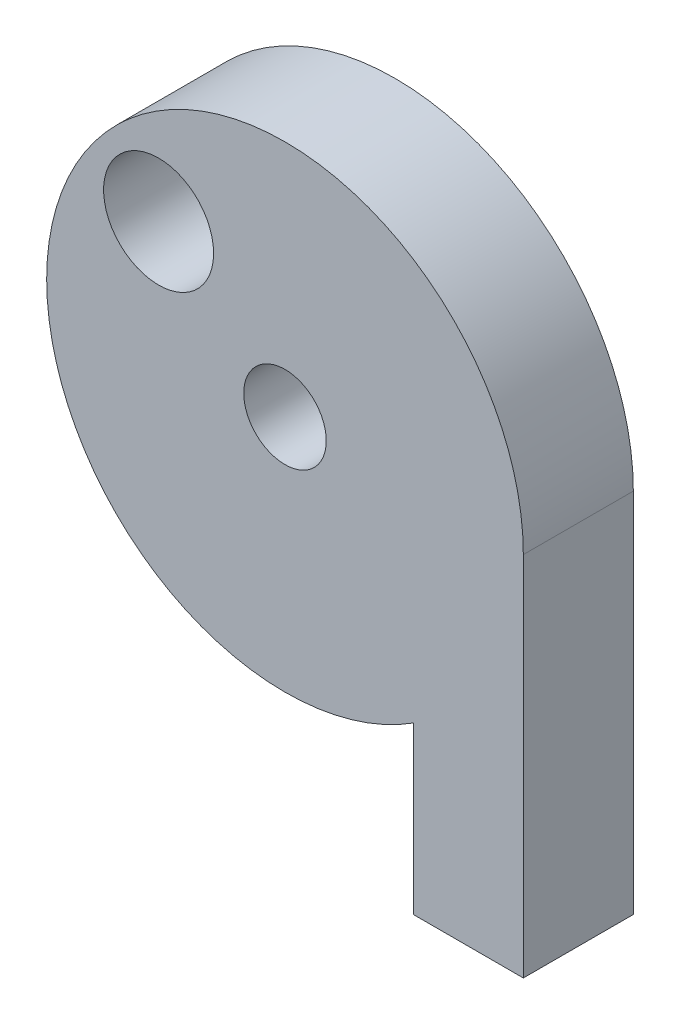
ISO-10303-21;
HEADER;
FILE_DESCRIPTION(('STEP AP214'),'2;1');
FILE_NAME('part.step','',(''),(''),'','','');
FILE_SCHEMA(('AUTOMOTIVE_DESIGN { 1 0 10303 214 1 1 1 1 }'));
ENDSEC;
DATA;
#1=APPLICATION_CONTEXT('core data for automotive mechanical design processes');
#2=APPLICATION_PROTOCOL_DEFINITION('international standard','automotive_design',2000,#1);
#3=PRODUCT_CONTEXT('',#1,'mechanical');
#4=PRODUCT('Part','Part','',(#3));
#5=PRODUCT_RELATED_PRODUCT_CATEGORY('part','',(#4));
#6=PRODUCT_DEFINITION_FORMATION('','',#4);
#7=PRODUCT_DEFINITION_CONTEXT('part definition',#1,'design');
#8=PRODUCT_DEFINITION('design','',#6,#7);
#9=PRODUCT_DEFINITION_SHAPE('','',#8);
#10=(LENGTH_UNIT() NAMED_UNIT(*) SI_UNIT(.MILLI.,.METRE.));
#11=(NAMED_UNIT(*) PLANE_ANGLE_UNIT() SI_UNIT($,.RADIAN.));
#12=(NAMED_UNIT(*) SI_UNIT($,.STERADIAN.) SOLID_ANGLE_UNIT());
#13=UNCERTAINTY_MEASURE_WITH_UNIT(LENGTH_MEASURE(1.E-05),#10,'distance_accuracy_value','');
#14=(GEOMETRIC_REPRESENTATION_CONTEXT(3) GLOBAL_UNCERTAINTY_ASSIGNED_CONTEXT((#13)) GLOBAL_UNIT_ASSIGNED_CONTEXT((#10,
#11,#12)) REPRESENTATION_CONTEXT('',''));
#15=CARTESIAN_POINT('',(0.,0.,0.));
#16=DIRECTION('',(0.,0.,1.));
#17=DIRECTION('',(1.,0.,0.));
#18=AXIS2_PLACEMENT_3D('',#15,#16,#17);
#19=CARTESIAN_POINT('',(0.,0.,3.));
#20=DIRECTION('',(0.,0.,-1.));
#21=DIRECTION('',(-1.,0.,0.));
#22=AXIS2_PLACEMENT_3D('',#19,#20,#21);
#23=CYLINDRICAL_SURFACE('',#22,13.);
#24=CARTESIAN_POINT('',(0.,0.,-3.));
#25=DIRECTION('',(0.,0.,1.));
#26=DIRECTION('',(1.,0.,0.));
#27=AXIS2_PLACEMENT_3D('',#24,#25,#26);
#28=CIRCLE('',#27,13.);
#29=CARTESIAN_POINT('',(13.,0.,-3.));
#30=VERTEX_POINT('',#29);
#31=CARTESIAN_POINT('',(7.,-10.9544511501033,-3.));
#32=VERTEX_POINT('',#31);
#33=EDGE_CURVE('E121',#30,#32,#28,.T.);
#34=ORIENTED_EDGE('',*,*,#33,.T.);
#35=DIRECTION('',(0.,0.,-1.));
#36=VECTOR('',#35,1.);
#37=CARTESIAN_POINT('',(7.,-10.9544511501033,3.));
#38=LINE('',#37,#36);
#39=CARTESIAN_POINT('',(7.,-10.9544511501033,3.));
#40=VERTEX_POINT('',#39);
#41=EDGE_CURVE('E11',#40,#32,#38,.T.);
#42=ORIENTED_EDGE('',*,*,#41,.F.);
#43=CARTESIAN_POINT('',(0.,0.,3.));
#44=DIRECTION('',(0.,0.,1.));
#45=DIRECTION('',(1.,0.,0.));
#46=AXIS2_PLACEMENT_3D('',#43,#44,#45);
#47=CIRCLE('',#46,13.);
#48=CARTESIAN_POINT('',(13.,0.,3.));
#49=VERTEX_POINT('',#48);
#50=EDGE_CURVE('E104',#49,#40,#47,.T.);
#51=ORIENTED_EDGE('',*,*,#50,.F.);
#52=DIRECTION('',(0.,0.,-1.));
#53=VECTOR('',#52,1.);
#54=CARTESIAN_POINT('',(13.,0.,3.));
#55=LINE('',#54,#53);
#56=EDGE_CURVE('E117',#49,#30,#55,.T.);
#57=ORIENTED_EDGE('',*,*,#56,.T.);
#58=EDGE_LOOP('',(#34,#42,#51,#57));
#59=FACE_BOUND('',#58,.T.);
#60=ADVANCED_FACE('F47',(#59),#23,.T.);
#61=CARTESIAN_POINT('',(7.,-20.,3.));
#62=DIRECTION('',(1.,0.,0.));
#63=DIRECTION('',(0.,1.,0.));
#64=AXIS2_PLACEMENT_3D('',#61,#62,#63);
#65=PLANE('',#64);
#66=DIRECTION('',(0.,-1.,0.));
#67=VECTOR('',#66,1.);
#68=CARTESIAN_POINT('',(7.,-20.,-3.));
#69=LINE('',#68,#67);
#70=CARTESIAN_POINT('',(7.,-20.,-3.));
#71=VERTEX_POINT('',#70);
#72=EDGE_CURVE('E109',#32,#71,#69,.T.);
#73=ORIENTED_EDGE('',*,*,#72,.T.);
#74=DIRECTION('',(0.,0.,-1.));
#75=VECTOR('',#74,1.);
#76=CARTESIAN_POINT('',(7.,-20.,3.));
#77=LINE('',#76,#75);
#78=CARTESIAN_POINT('',(7.,-20.,3.));
#79=VERTEX_POINT('',#78);
#80=EDGE_CURVE('E56',#79,#71,#77,.T.);
#81=ORIENTED_EDGE('',*,*,#80,.F.);
#82=DIRECTION('',(0.,-1.,0.));
#83=VECTOR('',#82,1.);
#84=CARTESIAN_POINT('',(7.,-20.,3.));
#85=LINE('',#84,#83);
#86=EDGE_CURVE('E99',#40,#79,#85,.T.);
#87=ORIENTED_EDGE('',*,*,#86,.F.);
#88=ORIENTED_EDGE('',*,*,#41,.T.);
#89=EDGE_LOOP('',(#73,#81,#87,#88));
#90=FACE_BOUND('',#89,.T.);
#91=ADVANCED_FACE('F108',(#90),#65,.F.);
#92=CARTESIAN_POINT('',(13.,-20.,3.));
#93=DIRECTION('',(0.,1.,0.));
#94=DIRECTION('',(0.,0.,1.));
#95=AXIS2_PLACEMENT_3D('',#92,#93,#94);
#96=PLANE('',#95);
#97=CARTESIAN_POINT('',(10.,-20.,0.));
#98=DIRECTION('',(0.,-1.,0.));
#99=DIRECTION('',(0.,0.,-1.));
#100=AXIS2_PLACEMENT_3D('',#97,#98,#99);
#101=CIRCLE('',#100,2.);
#102=CARTESIAN_POINT('',(10.,-20.,-2.));
#103=VERTEX_POINT('',#102);
#104=EDGE_CURVE('E148',#103,#103,#101,.T.);
#105=ORIENTED_EDGE('',*,*,#104,.F.);
#106=EDGE_LOOP('',(#105));
#107=FACE_BOUND('',#106,.T.);
#108=DIRECTION('',(1.,0.,0.));
#109=VECTOR('',#108,1.);
#110=CARTESIAN_POINT('',(13.,-20.,-3.));
#111=LINE('',#110,#109);
#112=CARTESIAN_POINT('',(13.,-20.,-3.));
#113=VERTEX_POINT('',#112);
#114=EDGE_CURVE('E84',#71,#113,#111,.T.);
#115=ORIENTED_EDGE('',*,*,#114,.T.);
#116=DIRECTION('',(0.,0.,-1.));
#117=VECTOR('',#116,1.);
#118=CARTESIAN_POINT('',(13.,-20.,3.));
#119=LINE('',#118,#117);
#120=CARTESIAN_POINT('',(13.,-20.,3.));
#121=VERTEX_POINT('',#120);
#122=EDGE_CURVE('E111',#121,#113,#119,.T.);
#123=ORIENTED_EDGE('',*,*,#122,.F.);
#124=DIRECTION('',(1.,0.,0.));
#125=VECTOR('',#124,1.);
#126=CARTESIAN_POINT('',(13.,-20.,3.));
#127=LINE('',#126,#125);
#128=EDGE_CURVE('E102',#79,#121,#127,.T.);
#129=ORIENTED_EDGE('',*,*,#128,.F.);
#130=ORIENTED_EDGE('',*,*,#80,.T.);
#131=EDGE_LOOP('',(#115,#123,#129,#130));
#132=FACE_BOUND('',#131,.T.);
#133=ADVANCED_FACE('F112',(#107,#132),#96,.F.);
#134=CARTESIAN_POINT('',(13.,0.,3.));
#135=DIRECTION('',(-1.,0.,0.));
#136=DIRECTION('',(0.,-1.,0.));
#137=AXIS2_PLACEMENT_3D('',#134,#135,#136);
#138=PLANE('',#137);
#139=DIRECTION('',(0.,1.,0.));
#140=VECTOR('',#139,1.);
#141=CARTESIAN_POINT('',(13.,0.,-3.));
#142=LINE('',#141,#140);
#143=EDGE_CURVE('E91',#113,#30,#142,.T.);
#144=ORIENTED_EDGE('',*,*,#143,.T.);
#145=ORIENTED_EDGE('',*,*,#56,.F.);
#146=DIRECTION('',(0.,1.,0.));
#147=VECTOR('',#146,1.);
#148=CARTESIAN_POINT('',(13.,0.,3.));
#149=LINE('',#148,#147);
#150=EDGE_CURVE('E67',#121,#49,#149,.T.);
#151=ORIENTED_EDGE('',*,*,#150,.F.);
#152=ORIENTED_EDGE('',*,*,#122,.T.);
#153=EDGE_LOOP('',(#144,#145,#151,#152));
#154=FACE_BOUND('',#153,.T.);
#155=ADVANCED_FACE('F133',(#154),#138,.F.);
#156=CARTESIAN_POINT('',(0.,0.,3.));
#157=DIRECTION('',(0.,0.,1.));
#158=DIRECTION('',(1.,0.,0.));
#159=AXIS2_PLACEMENT_3D('',#156,#157,#158);
#160=PLANE('',#159);
#161=CARTESIAN_POINT('',(-6.89439998807079,5.78508848717886,3.));
#162=DIRECTION('',(0.,0.,1.));
#163=DIRECTION('',(1.,0.,0.));
#164=AXIS2_PLACEMENT_3D('',#161,#162,#163);
#165=CIRCLE('',#164,3.);
#166=CARTESIAN_POINT('',(-3.89439998807079,5.78508848717886,3.));
#167=VERTEX_POINT('',#166);
#168=EDGE_CURVE('E151',#167,#167,#165,.T.);
#169=ORIENTED_EDGE('',*,*,#168,.F.);
#170=EDGE_LOOP('',(#169));
#171=FACE_BOUND('',#170,.T.);
#172=CARTESIAN_POINT('',(0.,0.,3.));
#173=DIRECTION('',(0.,0.,1.));
#174=DIRECTION('',(1.,0.,0.));
#175=AXIS2_PLACEMENT_3D('',#172,#173,#174);
#176=CIRCLE('',#175,2.25);
#177=CARTESIAN_POINT('',(2.25,0.,3.));
#178=VERTEX_POINT('',#177);
#179=EDGE_CURVE('E143',#178,#178,#176,.T.);
#180=ORIENTED_EDGE('',*,*,#179,.F.);
#181=EDGE_LOOP('',(#180));
#182=FACE_BOUND('',#181,.T.);
#183=ORIENTED_EDGE('',*,*,#50,.T.);
#184=ORIENTED_EDGE('',*,*,#86,.T.);
#185=ORIENTED_EDGE('',*,*,#128,.T.);
#186=ORIENTED_EDGE('',*,*,#150,.T.);
#187=EDGE_LOOP('',(#183,#184,#185,#186));
#188=FACE_BOUND('',#187,.T.);
#189=ADVANCED_FACE('F100',(#171,#182,#188),#160,.T.);
#190=CARTESIAN_POINT('',(0.,0.,-3.));
#191=DIRECTION('',(0.,0.,1.));
#192=DIRECTION('',(1.,0.,0.));
#193=AXIS2_PLACEMENT_3D('',#190,#191,#192);
#194=PLANE('',#193);
#195=CARTESIAN_POINT('',(-6.89439998807079,5.78508848717886,-3.));
#196=DIRECTION('',(0.,0.,1.));
#197=DIRECTION('',(1.,0.,0.));
#198=AXIS2_PLACEMENT_3D('',#195,#196,#197);
#199=CIRCLE('',#198,3.);
#200=CARTESIAN_POINT('',(-3.89439998807079,5.78508848717886,-3.));
#201=VERTEX_POINT('',#200);
#202=EDGE_CURVE('E155',#201,#201,#199,.T.);
#203=ORIENTED_EDGE('',*,*,#202,.T.);
#204=EDGE_LOOP('',(#203));
#205=FACE_BOUND('',#204,.T.);
#206=CARTESIAN_POINT('',(0.,0.,-3.));
#207=DIRECTION('',(0.,0.,1.));
#208=DIRECTION('',(1.,0.,0.));
#209=AXIS2_PLACEMENT_3D('',#206,#207,#208);
#210=CIRCLE('',#209,2.25);
#211=CARTESIAN_POINT('',(2.25,0.,-3.));
#212=VERTEX_POINT('',#211);
#213=EDGE_CURVE('E125',#212,#212,#210,.T.);
#214=ORIENTED_EDGE('',*,*,#213,.T.);
#215=EDGE_LOOP('',(#214));
#216=FACE_BOUND('',#215,.T.);
#217=ORIENTED_EDGE('',*,*,#33,.F.);
#218=ORIENTED_EDGE('',*,*,#143,.F.);
#219=ORIENTED_EDGE('',*,*,#114,.F.);
#220=ORIENTED_EDGE('',*,*,#72,.F.);
#221=EDGE_LOOP('',(#217,#218,#219,#220));
#222=FACE_BOUND('',#221,.T.);
#223=ADVANCED_FACE('F136',(#205,#216,#222),#194,.F.);
#224=CARTESIAN_POINT('',(0.,0.,3.));
#225=DIRECTION('',(0.,0.,1.));
#226=DIRECTION('',(1.,0.,0.));
#227=AXIS2_PLACEMENT_3D('',#224,#225,#226);
#228=CYLINDRICAL_SURFACE('',#227,2.25);
#229=ORIENTED_EDGE('',*,*,#213,.F.);
#230=EDGE_LOOP('',(#229));
#231=FACE_BOUND('',#230,.T.);
#232=ORIENTED_EDGE('',*,*,#179,.T.);
#233=EDGE_LOOP('',(#232));
#234=FACE_BOUND('',#233,.T.);
#235=ADVANCED_FACE('F171',(#231,#234),#228,.F.);
#236=CARTESIAN_POINT('',(10.,0.,0.));
#237=DIRECTION('',(0.,-1.,0.));
#238=DIRECTION('',(0.,0.,-1.));
#239=AXIS2_PLACEMENT_3D('',#236,#237,#238);
#240=CYLINDRICAL_SURFACE('',#239,2.);
#241=CARTESIAN_POINT('',(10.,0.,0.));
#242=DIRECTION('',(0.,-1.,0.));
#243=DIRECTION('',(0.,0.,-1.));
#244=AXIS2_PLACEMENT_3D('',#241,#242,#243);
#245=CIRCLE('',#244,2.);
#246=CARTESIAN_POINT('',(10.,0.,-2.));
#247=VERTEX_POINT('',#246);
#248=EDGE_CURVE('E147',#247,#247,#245,.T.);
#249=ORIENTED_EDGE('',*,*,#248,.F.);
#250=EDGE_LOOP('',(#249));
#251=FACE_BOUND('',#250,.T.);
#252=ORIENTED_EDGE('',*,*,#104,.T.);
#253=EDGE_LOOP('',(#252));
#254=FACE_BOUND('',#253,.T.);
#255=ADVANCED_FACE('F173',(#251,#254),#240,.F.);
#256=CARTESIAN_POINT('',(10.,0.,0.));
#257=DIRECTION('',(0.,-1.,0.));
#258=DIRECTION('',(0.,0.,-1.));
#259=AXIS2_PLACEMENT_3D('',#256,#257,#258);
#260=PLANE('',#259);
#261=ORIENTED_EDGE('',*,*,#248,.T.);
#262=EDGE_LOOP('',(#261));
#263=FACE_BOUND('',#262,.T.);
#264=ADVANCED_FACE('F180',(#263),#260,.T.);
#265=CARTESIAN_POINT('',(-6.89439998807079,5.78508848717886,3.));
#266=DIRECTION('',(0.,0.,-1.));
#267=DIRECTION('',(-1.,0.,0.));
#268=AXIS2_PLACEMENT_3D('',#265,#266,#267);
#269=CYLINDRICAL_SURFACE('',#268,3.);
#270=ORIENTED_EDGE('',*,*,#168,.T.);
#271=EDGE_LOOP('',(#270));
#272=FACE_BOUND('',#271,.T.);
#273=ORIENTED_EDGE('',*,*,#202,.F.);
#274=EDGE_LOOP('',(#273));
#275=FACE_BOUND('',#274,.T.);
#276=ADVANCED_FACE('F163',(#272,#275),#269,.F.);
#277=CLOSED_SHELL('',(#60,#91,#133,#155,#189,#223,#235,#255,#264,#276));
#278=MANIFOLD_SOLID_BREP('B2',#277);
#279=ADVANCED_BREP_SHAPE_REPRESENTATION('',(#18,#278),#14);
#280=SHAPE_DEFINITION_REPRESENTATION(#9,#279);
ENDSEC;
END-ISO-10303-21;
